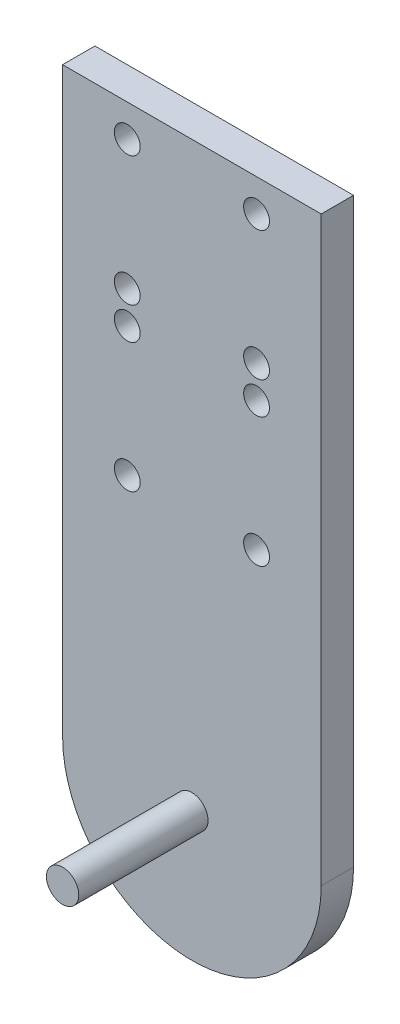
ISO-10303-21;
HEADER;
FILE_DESCRIPTION(('STEP AP214'),'2;1');
FILE_NAME('part.step','',(''),(''),'','','');
FILE_SCHEMA(('AUTOMOTIVE_DESIGN { 1 0 10303 214 1 1 1 1 }'));
ENDSEC;
DATA;
#1=APPLICATION_CONTEXT('core data for automotive mechanical design processes');
#2=APPLICATION_PROTOCOL_DEFINITION('international standard','automotive_design',2000,#1);
#3=PRODUCT_CONTEXT('',#1,'mechanical');
#4=PRODUCT('Part','Part','',(#3));
#5=PRODUCT_RELATED_PRODUCT_CATEGORY('part','',(#4));
#6=PRODUCT_DEFINITION_FORMATION('','',#4);
#7=PRODUCT_DEFINITION_CONTEXT('part definition',#1,'design');
#8=PRODUCT_DEFINITION('design','',#6,#7);
#9=PRODUCT_DEFINITION_SHAPE('','',#8);
#10=(LENGTH_UNIT() NAMED_UNIT(*) SI_UNIT(.MILLI.,.METRE.));
#11=(NAMED_UNIT(*) PLANE_ANGLE_UNIT() SI_UNIT($,.RADIAN.));
#12=(NAMED_UNIT(*) SI_UNIT($,.STERADIAN.) SOLID_ANGLE_UNIT());
#13=UNCERTAINTY_MEASURE_WITH_UNIT(LENGTH_MEASURE(1.E-05),#10,'distance_accuracy_value','');
#14=(GEOMETRIC_REPRESENTATION_CONTEXT(3) GLOBAL_UNCERTAINTY_ASSIGNED_CONTEXT((#13)) GLOBAL_UNIT_ASSIGNED_CONTEXT((#10,
#11,#12)) REPRESENTATION_CONTEXT('',''));
#15=CARTESIAN_POINT('',(0.,0.,0.));
#16=DIRECTION('',(0.,0.,1.));
#17=DIRECTION('',(1.,0.,0.));
#18=AXIS2_PLACEMENT_3D('',#15,#16,#17);
#19=CARTESIAN_POINT('',(-20.,0.,5.));
#20=DIRECTION('',(0.,0.,-1.));
#21=DIRECTION('',(-1.,0.,0.));
#22=AXIS2_PLACEMENT_3D('',#19,#20,#21);
#23=CYLINDRICAL_SURFACE('',#22,20.);
#24=CARTESIAN_POINT('',(-20.,0.,0.));
#25=DIRECTION('',(0.,0.,1.));
#26=DIRECTION('',(1.,0.,0.));
#27=AXIS2_PLACEMENT_3D('',#24,#25,#26);
#28=CIRCLE('',#27,20.);
#29=CARTESIAN_POINT('',(-40.,0.,0.));
#30=VERTEX_POINT('',#29);
#31=CARTESIAN_POINT('',(0.,0.,0.));
#32=VERTEX_POINT('',#31);
#33=EDGE_CURVE('E112',#30,#32,#28,.T.);
#34=ORIENTED_EDGE('',*,*,#33,.T.);
#35=DIRECTION('',(0.,0.,-1.));
#36=VECTOR('',#35,1.);
#37=CARTESIAN_POINT('',(0.,0.,5.));
#38=LINE('',#37,#36);
#39=CARTESIAN_POINT('',(0.,0.,5.));
#40=VERTEX_POINT('',#39);
#41=EDGE_CURVE('E13',#40,#32,#38,.T.);
#42=ORIENTED_EDGE('',*,*,#41,.F.);
#43=CARTESIAN_POINT('',(-20.,0.,5.));
#44=DIRECTION('',(0.,0.,1.));
#45=DIRECTION('',(1.,0.,0.));
#46=AXIS2_PLACEMENT_3D('',#43,#44,#45);
#47=CIRCLE('',#46,20.);
#48=CARTESIAN_POINT('',(-40.,0.,5.));
#49=VERTEX_POINT('',#48);
#50=EDGE_CURVE('E99',#49,#40,#47,.T.);
#51=ORIENTED_EDGE('',*,*,#50,.F.);
#52=DIRECTION('',(0.,0.,-1.));
#53=VECTOR('',#52,1.);
#54=CARTESIAN_POINT('',(-40.,0.,5.));
#55=LINE('',#54,#53);
#56=EDGE_CURVE('E108',#49,#30,#55,.T.);
#57=ORIENTED_EDGE('',*,*,#56,.T.);
#58=EDGE_LOOP('',(#34,#42,#51,#57));
#59=FACE_BOUND('',#58,.T.);
#60=ADVANCED_FACE('F46',(#59),#23,.T.);
#61=CARTESIAN_POINT('',(0.,0.,5.));
#62=DIRECTION('',(-1.,0.,0.));
#63=DIRECTION('',(0.,0.,1.));
#64=AXIS2_PLACEMENT_3D('',#61,#62,#63);
#65=PLANE('',#64);
#66=DIRECTION('',(0.,1.,0.));
#67=VECTOR('',#66,1.);
#68=CARTESIAN_POINT('',(0.,0.,0.));
#69=LINE('',#68,#67);
#70=CARTESIAN_POINT('',(0.,90.,0.));
#71=VERTEX_POINT('',#70);
#72=EDGE_CURVE('E103',#32,#71,#69,.T.);
#73=ORIENTED_EDGE('',*,*,#72,.T.);
#74=DIRECTION('',(0.,0.,-1.));
#75=VECTOR('',#74,1.);
#76=CARTESIAN_POINT('',(0.,90.,5.));
#77=LINE('',#76,#75);
#78=CARTESIAN_POINT('',(0.,90.,5.));
#79=VERTEX_POINT('',#78);
#80=EDGE_CURVE('E55',#79,#71,#77,.T.);
#81=ORIENTED_EDGE('',*,*,#80,.F.);
#82=DIRECTION('',(0.,1.,0.));
#83=VECTOR('',#82,1.);
#84=CARTESIAN_POINT('',(0.,0.,5.));
#85=LINE('',#84,#83);
#86=EDGE_CURVE('E94',#40,#79,#85,.T.);
#87=ORIENTED_EDGE('',*,*,#86,.F.);
#88=ORIENTED_EDGE('',*,*,#41,.T.);
#89=EDGE_LOOP('',(#73,#81,#87,#88));
#90=FACE_BOUND('',#89,.T.);
#91=ADVANCED_FACE('F102',(#90),#65,.F.);
#92=CARTESIAN_POINT('',(-40.,90.,5.));
#93=DIRECTION('',(0.,-1.,0.));
#94=DIRECTION('',(0.,0.,-1.));
#95=AXIS2_PLACEMENT_3D('',#92,#93,#94);
#96=PLANE('',#95);
#97=DIRECTION('',(-1.,0.,0.));
#98=VECTOR('',#97,1.);
#99=CARTESIAN_POINT('',(-40.,90.,0.));
#100=LINE('',#99,#98);
#101=CARTESIAN_POINT('',(-40.,90.,0.));
#102=VERTEX_POINT('',#101);
#103=EDGE_CURVE('E81',#71,#102,#100,.T.);
#104=ORIENTED_EDGE('',*,*,#103,.T.);
#105=DIRECTION('',(0.,0.,-1.));
#106=VECTOR('',#105,1.);
#107=CARTESIAN_POINT('',(-40.,90.,5.));
#108=LINE('',#107,#106);
#109=CARTESIAN_POINT('',(-40.,90.,5.));
#110=VERTEX_POINT('',#109);
#111=EDGE_CURVE('E104',#110,#102,#108,.T.);
#112=ORIENTED_EDGE('',*,*,#111,.F.);
#113=DIRECTION('',(-1.,0.,0.));
#114=VECTOR('',#113,1.);
#115=CARTESIAN_POINT('',(-40.,90.,5.));
#116=LINE('',#115,#114);
#117=EDGE_CURVE('E97',#79,#110,#116,.T.);
#118=ORIENTED_EDGE('',*,*,#117,.F.);
#119=ORIENTED_EDGE('',*,*,#80,.T.);
#120=EDGE_LOOP('',(#104,#112,#118,#119));
#121=FACE_BOUND('',#120,.T.);
#122=ADVANCED_FACE('F106',(#121),#96,.F.);
#123=CARTESIAN_POINT('',(-40.,0.,5.));
#124=DIRECTION('',(1.,0.,0.));
#125=DIRECTION('',(0.,0.,-1.));
#126=AXIS2_PLACEMENT_3D('',#123,#124,#125);
#127=PLANE('',#126);
#128=DIRECTION('',(0.,-1.,0.));
#129=VECTOR('',#128,1.);
#130=CARTESIAN_POINT('',(-40.,0.,0.));
#131=LINE('',#130,#129);
#132=EDGE_CURVE('E87',#102,#30,#131,.T.);
#133=ORIENTED_EDGE('',*,*,#132,.T.);
#134=ORIENTED_EDGE('',*,*,#56,.F.);
#135=DIRECTION('',(0.,-1.,0.));
#136=VECTOR('',#135,1.);
#137=CARTESIAN_POINT('',(-40.,0.,5.));
#138=LINE('',#137,#136);
#139=EDGE_CURVE('E64',#110,#49,#138,.T.);
#140=ORIENTED_EDGE('',*,*,#139,.F.);
#141=ORIENTED_EDGE('',*,*,#111,.T.);
#142=EDGE_LOOP('',(#133,#134,#140,#141));
#143=FACE_BOUND('',#142,.T.);
#144=ADVANCED_FACE('F171',(#143),#127,.F.);
#145=CARTESIAN_POINT('',(-20.,0.,5.));
#146=DIRECTION('',(0.,0.,1.));
#147=DIRECTION('',(1.,0.,0.));
#148=AXIS2_PLACEMENT_3D('',#145,#146,#147);
#149=PLANE('',#148);
#150=CARTESIAN_POINT('',(-10.,40.,5.));
#151=DIRECTION('',(0.,0.,1.));
#152=DIRECTION('',(1.,0.,0.));
#153=AXIS2_PLACEMENT_3D('',#150,#151,#152);
#154=CIRCLE('',#153,2.);
#155=CARTESIAN_POINT('',(-8.,40.,5.));
#156=VERTEX_POINT('',#155);
#157=EDGE_CURVE('E314',#156,#156,#154,.T.);
#158=ORIENTED_EDGE('',*,*,#157,.F.);
#159=EDGE_LOOP('',(#158));
#160=FACE_BOUND('',#159,.T.);
#161=CARTESIAN_POINT('',(-30.,40.,5.));
#162=DIRECTION('',(0.,0.,1.));
#163=DIRECTION('',(1.,0.,0.));
#164=AXIS2_PLACEMENT_3D('',#161,#162,#163);
#165=CIRCLE('',#164,2.);
#166=CARTESIAN_POINT('',(-28.,40.,5.));
#167=VERTEX_POINT('',#166);
#168=EDGE_CURVE('E318',#167,#167,#165,.T.);
#169=ORIENTED_EDGE('',*,*,#168,.F.);
#170=EDGE_LOOP('',(#169));
#171=FACE_BOUND('',#170,.T.);
#172=CARTESIAN_POINT('',(-30.,65.,5.));
#173=DIRECTION('',(0.,0.,1.));
#174=DIRECTION('',(1.,0.,0.));
#175=AXIS2_PLACEMENT_3D('',#172,#173,#174);
#176=CIRCLE('',#175,2.);
#177=CARTESIAN_POINT('',(-28.,65.,5.));
#178=VERTEX_POINT('',#177);
#179=EDGE_CURVE('E138',#178,#178,#176,.T.);
#180=ORIENTED_EDGE('',*,*,#179,.F.);
#181=EDGE_LOOP('',(#180));
#182=FACE_BOUND('',#181,.T.);
#183=CARTESIAN_POINT('',(-10.,65.,5.));
#184=DIRECTION('',(0.,0.,1.));
#185=DIRECTION('',(1.,0.,0.));
#186=AXIS2_PLACEMENT_3D('',#183,#184,#185);
#187=CIRCLE('',#186,2.);
#188=CARTESIAN_POINT('',(-8.,65.,5.));
#189=VERTEX_POINT('',#188);
#190=EDGE_CURVE('E144',#189,#189,#187,.T.);
#191=ORIENTED_EDGE('',*,*,#190,.F.);
#192=EDGE_LOOP('',(#191));
#193=FACE_BOUND('',#192,.T.);
#194=CARTESIAN_POINT('',(-30.,60.,5.));
#195=DIRECTION('',(0.,0.,1.));
#196=DIRECTION('',(1.,0.,0.));
#197=AXIS2_PLACEMENT_3D('',#194,#195,#196);
#198=CIRCLE('',#197,2.);
#199=CARTESIAN_POINT('',(-28.,60.,5.));
#200=VERTEX_POINT('',#199);
#201=EDGE_CURVE('E133',#200,#200,#198,.T.);
#202=ORIENTED_EDGE('',*,*,#201,.F.);
#203=EDGE_LOOP('',(#202));
#204=FACE_BOUND('',#203,.T.);
#205=CARTESIAN_POINT('',(-10.,60.,5.));
#206=DIRECTION('',(0.,0.,1.));
#207=DIRECTION('',(1.,0.,0.));
#208=AXIS2_PLACEMENT_3D('',#205,#206,#207);
#209=CIRCLE('',#208,2.);
#210=CARTESIAN_POINT('',(-8.,60.,5.));
#211=VERTEX_POINT('',#210);
#212=EDGE_CURVE('E142',#211,#211,#209,.T.);
#213=ORIENTED_EDGE('',*,*,#212,.F.);
#214=EDGE_LOOP('',(#213));
#215=FACE_BOUND('',#214,.T.);
#216=CARTESIAN_POINT('',(-30.,85.,5.));
#217=DIRECTION('',(0.,0.,1.));
#218=DIRECTION('',(1.,0.,0.));
#219=AXIS2_PLACEMENT_3D('',#216,#217,#218);
#220=CIRCLE('',#219,2.);
#221=CARTESIAN_POINT('',(-28.,85.,5.));
#222=VERTEX_POINT('',#221);
#223=EDGE_CURVE('E125',#222,#222,#220,.T.);
#224=ORIENTED_EDGE('',*,*,#223,.F.);
#225=EDGE_LOOP('',(#224));
#226=FACE_BOUND('',#225,.T.);
#227=CARTESIAN_POINT('',(-10.,85.,5.));
#228=DIRECTION('',(0.,0.,1.));
#229=DIRECTION('',(1.,0.,0.));
#230=AXIS2_PLACEMENT_3D('',#227,#228,#229);
#231=CIRCLE('',#230,2.);
#232=CARTESIAN_POINT('',(-8.,85.,5.));
#233=VERTEX_POINT('',#232);
#234=EDGE_CURVE('E135',#233,#233,#231,.T.);
#235=ORIENTED_EDGE('',*,*,#234,.F.);
#236=EDGE_LOOP('',(#235));
#237=FACE_BOUND('',#236,.T.);
#238=CARTESIAN_POINT('',(-20.,0.,5.));
#239=DIRECTION('',(0.,0.,1.));
#240=DIRECTION('',(1.,0.,0.));
#241=AXIS2_PLACEMENT_3D('',#238,#239,#240);
#242=CIRCLE('',#241,2.5);
#243=CARTESIAN_POINT('',(-17.5,0.,5.));
#244=VERTEX_POINT('',#243);
#245=EDGE_CURVE('E128',#244,#244,#242,.T.);
#246=ORIENTED_EDGE('',*,*,#245,.F.);
#247=EDGE_LOOP('',(#246));
#248=FACE_BOUND('',#247,.T.);
#249=ORIENTED_EDGE('',*,*,#50,.T.);
#250=ORIENTED_EDGE('',*,*,#86,.T.);
#251=ORIENTED_EDGE('',*,*,#117,.T.);
#252=ORIENTED_EDGE('',*,*,#139,.T.);
#253=EDGE_LOOP('',(#249,#250,#251,#252));
#254=FACE_BOUND('',#253,.T.);
#255=ADVANCED_FACE('F95',(#160,#171,#182,#193,#204,#215,#226,#237,#248,#254),#149,.T.);
#256=CARTESIAN_POINT('',(-20.,0.,0.));
#257=DIRECTION('',(0.,0.,1.));
#258=DIRECTION('',(1.,0.,0.));
#259=AXIS2_PLACEMENT_3D('',#256,#257,#258);
#260=PLANE('',#259);
#261=CARTESIAN_POINT('',(-10.,40.,0.));
#262=DIRECTION('',(0.,0.,1.));
#263=DIRECTION('',(1.,0.,0.));
#264=AXIS2_PLACEMENT_3D('',#261,#262,#263);
#265=CIRCLE('',#264,2.);
#266=CARTESIAN_POINT('',(-8.,40.,0.));
#267=VERTEX_POINT('',#266);
#268=EDGE_CURVE('E317',#267,#267,#265,.T.);
#269=ORIENTED_EDGE('',*,*,#268,.T.);
#270=EDGE_LOOP('',(#269));
#271=FACE_BOUND('',#270,.T.);
#272=CARTESIAN_POINT('',(-30.,40.,0.));
#273=DIRECTION('',(0.,0.,1.));
#274=DIRECTION('',(1.,0.,0.));
#275=AXIS2_PLACEMENT_3D('',#272,#273,#274);
#276=CIRCLE('',#275,2.);
#277=CARTESIAN_POINT('',(-28.,40.,0.));
#278=VERTEX_POINT('',#277);
#279=EDGE_CURVE('E149',#278,#278,#276,.T.);
#280=ORIENTED_EDGE('',*,*,#279,.T.);
#281=EDGE_LOOP('',(#280));
#282=FACE_BOUND('',#281,.T.);
#283=CARTESIAN_POINT('',(-30.,65.,0.));
#284=DIRECTION('',(0.,0.,1.));
#285=DIRECTION('',(1.,0.,0.));
#286=AXIS2_PLACEMENT_3D('',#283,#284,#285);
#287=CIRCLE('',#286,2.);
#288=CARTESIAN_POINT('',(-28.,65.,0.));
#289=VERTEX_POINT('',#288);
#290=EDGE_CURVE('E49',#289,#289,#287,.T.);
#291=ORIENTED_EDGE('',*,*,#290,.T.);
#292=EDGE_LOOP('',(#291));
#293=FACE_BOUND('',#292,.T.);
#294=CARTESIAN_POINT('',(-10.,65.,0.));
#295=DIRECTION('',(0.,0.,1.));
#296=DIRECTION('',(1.,0.,0.));
#297=AXIS2_PLACEMENT_3D('',#294,#295,#296);
#298=CIRCLE('',#297,2.);
#299=CARTESIAN_POINT('',(-8.,65.,0.));
#300=VERTEX_POINT('',#299);
#301=EDGE_CURVE('E136',#300,#300,#298,.T.);
#302=ORIENTED_EDGE('',*,*,#301,.T.);
#303=EDGE_LOOP('',(#302));
#304=FACE_BOUND('',#303,.T.);
#305=CARTESIAN_POINT('',(-30.,60.,0.));
#306=DIRECTION('',(0.,0.,1.));
#307=DIRECTION('',(1.,0.,0.));
#308=AXIS2_PLACEMENT_3D('',#305,#306,#307);
#309=CIRCLE('',#308,2.);
#310=CARTESIAN_POINT('',(-28.,60.,0.));
#311=VERTEX_POINT('',#310);
#312=EDGE_CURVE('E132',#311,#311,#309,.T.);
#313=ORIENTED_EDGE('',*,*,#312,.T.);
#314=EDGE_LOOP('',(#313));
#315=FACE_BOUND('',#314,.T.);
#316=CARTESIAN_POINT('',(-10.,60.,0.));
#317=DIRECTION('',(0.,0.,1.));
#318=DIRECTION('',(1.,0.,0.));
#319=AXIS2_PLACEMENT_3D('',#316,#317,#318);
#320=CIRCLE('',#319,2.);
#321=CARTESIAN_POINT('',(-8.,60.,0.));
#322=VERTEX_POINT('',#321);
#323=EDGE_CURVE('E129',#322,#322,#320,.T.);
#324=ORIENTED_EDGE('',*,*,#323,.T.);
#325=EDGE_LOOP('',(#324));
#326=FACE_BOUND('',#325,.T.);
#327=CARTESIAN_POINT('',(-30.,85.,0.));
#328=DIRECTION('',(0.,0.,1.));
#329=DIRECTION('',(1.,0.,0.));
#330=AXIS2_PLACEMENT_3D('',#327,#328,#329);
#331=CIRCLE('',#330,2.);
#332=CARTESIAN_POINT('',(-28.,85.,0.));
#333=VERTEX_POINT('',#332);
#334=EDGE_CURVE('E124',#333,#333,#331,.T.);
#335=ORIENTED_EDGE('',*,*,#334,.T.);
#336=EDGE_LOOP('',(#335));
#337=FACE_BOUND('',#336,.T.);
#338=CARTESIAN_POINT('',(-10.,85.,0.));
#339=DIRECTION('',(0.,0.,1.));
#340=DIRECTION('',(1.,0.,0.));
#341=AXIS2_PLACEMENT_3D('',#338,#339,#340);
#342=CIRCLE('',#341,2.);
#343=CARTESIAN_POINT('',(-8.,85.,0.));
#344=VERTEX_POINT('',#343);
#345=EDGE_CURVE('E121',#344,#344,#342,.T.);
#346=ORIENTED_EDGE('',*,*,#345,.T.);
#347=EDGE_LOOP('',(#346));
#348=FACE_BOUND('',#347,.T.);
#349=ORIENTED_EDGE('',*,*,#33,.F.);
#350=ORIENTED_EDGE('',*,*,#132,.F.);
#351=ORIENTED_EDGE('',*,*,#103,.F.);
#352=ORIENTED_EDGE('',*,*,#72,.F.);
#353=EDGE_LOOP('',(#349,#350,#351,#352));
#354=FACE_BOUND('',#353,.T.);
#355=ADVANCED_FACE('F170',(#271,#282,#293,#304,#315,#326,#337,#348,#354),#260,.F.);
#356=CARTESIAN_POINT('',(-20.,0.,25.));
#357=DIRECTION('',(0.,0.,-1.));
#358=DIRECTION('',(-1.,0.,0.));
#359=AXIS2_PLACEMENT_3D('',#356,#357,#358);
#360=CYLINDRICAL_SURFACE('',#359,2.5);
#361=CARTESIAN_POINT('',(-20.,0.,25.));
#362=DIRECTION('',(0.,0.,1.));
#363=DIRECTION('',(1.,0.,0.));
#364=AXIS2_PLACEMENT_3D('',#361,#362,#363);
#365=CIRCLE('',#364,2.5);
#366=CARTESIAN_POINT('',(-17.5,0.,25.));
#367=VERTEX_POINT('',#366);
#368=EDGE_CURVE('E115',#367,#367,#365,.T.);
#369=ORIENTED_EDGE('',*,*,#368,.F.);
#370=EDGE_LOOP('',(#369));
#371=FACE_BOUND('',#370,.T.);
#372=ORIENTED_EDGE('',*,*,#245,.T.);
#373=EDGE_LOOP('',(#372));
#374=FACE_BOUND('',#373,.T.);
#375=ADVANCED_FACE('F167',(#371,#374),#360,.T.);
#376=CARTESIAN_POINT('',(-20.,0.,25.));
#377=DIRECTION('',(0.,0.,1.));
#378=DIRECTION('',(1.,0.,0.));
#379=AXIS2_PLACEMENT_3D('',#376,#377,#378);
#380=PLANE('',#379);
#381=ORIENTED_EDGE('',*,*,#368,.T.);
#382=EDGE_LOOP('',(#381));
#383=FACE_BOUND('',#382,.T.);
#384=ADVANCED_FACE('F211',(#383),#380,.T.);
#385=CARTESIAN_POINT('',(-10.,85.,-45.));
#386=DIRECTION('',(0.,0.,1.));
#387=DIRECTION('',(1.,0.,0.));
#388=AXIS2_PLACEMENT_3D('',#385,#386,#387);
#389=CYLINDRICAL_SURFACE('',#388,2.);
#390=ORIENTED_EDGE('',*,*,#234,.T.);
#391=EDGE_LOOP('',(#390));
#392=FACE_BOUND('',#391,.T.);
#393=ORIENTED_EDGE('',*,*,#345,.F.);
#394=EDGE_LOOP('',(#393));
#395=FACE_BOUND('',#394,.T.);
#396=ADVANCED_FACE('F221',(#392,#395),#389,.F.);
#397=CARTESIAN_POINT('',(-30.,85.,-45.));
#398=DIRECTION('',(0.,0.,1.));
#399=DIRECTION('',(1.,0.,0.));
#400=AXIS2_PLACEMENT_3D('',#397,#398,#399);
#401=CYLINDRICAL_SURFACE('',#400,2.);
#402=ORIENTED_EDGE('',*,*,#223,.T.);
#403=EDGE_LOOP('',(#402));
#404=FACE_BOUND('',#403,.T.);
#405=ORIENTED_EDGE('',*,*,#334,.F.);
#406=EDGE_LOOP('',(#405));
#407=FACE_BOUND('',#406,.T.);
#408=ADVANCED_FACE('F231',(#404,#407),#401,.F.);
#409=CARTESIAN_POINT('',(-10.,60.,-45.));
#410=DIRECTION('',(0.,0.,1.));
#411=DIRECTION('',(1.,0.,0.));
#412=AXIS2_PLACEMENT_3D('',#409,#410,#411);
#413=CYLINDRICAL_SURFACE('',#412,2.);
#414=ORIENTED_EDGE('',*,*,#212,.T.);
#415=EDGE_LOOP('',(#414));
#416=FACE_BOUND('',#415,.T.);
#417=ORIENTED_EDGE('',*,*,#323,.F.);
#418=EDGE_LOOP('',(#417));
#419=FACE_BOUND('',#418,.T.);
#420=ADVANCED_FACE('F241',(#416,#419),#413,.F.);
#421=CARTESIAN_POINT('',(-30.,60.,-45.));
#422=DIRECTION('',(0.,0.,1.));
#423=DIRECTION('',(1.,0.,0.));
#424=AXIS2_PLACEMENT_3D('',#421,#422,#423);
#425=CYLINDRICAL_SURFACE('',#424,2.);
#426=ORIENTED_EDGE('',*,*,#201,.T.);
#427=EDGE_LOOP('',(#426));
#428=FACE_BOUND('',#427,.T.);
#429=ORIENTED_EDGE('',*,*,#312,.F.);
#430=EDGE_LOOP('',(#429));
#431=FACE_BOUND('',#430,.T.);
#432=ADVANCED_FACE('F251',(#428,#431),#425,.F.);
#433=CARTESIAN_POINT('',(-10.,65.,-45.));
#434=DIRECTION('',(0.,0.,1.));
#435=DIRECTION('',(1.,0.,0.));
#436=AXIS2_PLACEMENT_3D('',#433,#434,#435);
#437=CYLINDRICAL_SURFACE('',#436,2.);
#438=ORIENTED_EDGE('',*,*,#190,.T.);
#439=EDGE_LOOP('',(#438));
#440=FACE_BOUND('',#439,.T.);
#441=ORIENTED_EDGE('',*,*,#301,.F.);
#442=EDGE_LOOP('',(#441));
#443=FACE_BOUND('',#442,.T.);
#444=ADVANCED_FACE('F260',(#440,#443),#437,.F.);
#445=CARTESIAN_POINT('',(-30.,65.,-45.));
#446=DIRECTION('',(0.,0.,1.));
#447=DIRECTION('',(1.,0.,0.));
#448=AXIS2_PLACEMENT_3D('',#445,#446,#447);
#449=CYLINDRICAL_SURFACE('',#448,2.);
#450=ORIENTED_EDGE('',*,*,#179,.T.);
#451=EDGE_LOOP('',(#450));
#452=FACE_BOUND('',#451,.T.);
#453=ORIENTED_EDGE('',*,*,#290,.F.);
#454=EDGE_LOOP('',(#453));
#455=FACE_BOUND('',#454,.T.);
#456=ADVANCED_FACE('F279',(#452,#455),#449,.F.);
#457=CARTESIAN_POINT('',(-30.,40.,-45.));
#458=DIRECTION('',(0.,0.,1.));
#459=DIRECTION('',(1.,0.,0.));
#460=AXIS2_PLACEMENT_3D('',#457,#458,#459);
#461=CYLINDRICAL_SURFACE('',#460,2.);
#462=ORIENTED_EDGE('',*,*,#168,.T.);
#463=EDGE_LOOP('',(#462));
#464=FACE_BOUND('',#463,.T.);
#465=ORIENTED_EDGE('',*,*,#279,.F.);
#466=EDGE_LOOP('',(#465));
#467=FACE_BOUND('',#466,.T.);
#468=ADVANCED_FACE('F289',(#464,#467),#461,.F.);
#469=CARTESIAN_POINT('',(-10.,40.,-45.));
#470=DIRECTION('',(0.,0.,1.));
#471=DIRECTION('',(1.,0.,0.));
#472=AXIS2_PLACEMENT_3D('',#469,#470,#471);
#473=CYLINDRICAL_SURFACE('',#472,2.);
#474=ORIENTED_EDGE('',*,*,#157,.T.);
#475=EDGE_LOOP('',(#474));
#476=FACE_BOUND('',#475,.T.);
#477=ORIENTED_EDGE('',*,*,#268,.F.);
#478=EDGE_LOOP('',(#477));
#479=FACE_BOUND('',#478,.T.);
#480=ADVANCED_FACE('F298',(#476,#479),#473,.F.);
#481=CLOSED_SHELL('',(#60,#91,#122,#144,#255,#355,#375,#384,#396,#408,#420,#432,#444,#456,#468,#480));
#482=MANIFOLD_SOLID_BREP('B2',#481);
#483=ADVANCED_BREP_SHAPE_REPRESENTATION('',(#18,#482),#14);
#484=SHAPE_DEFINITION_REPRESENTATION(#9,#483);
ENDSEC;
END-ISO-10303-21;
